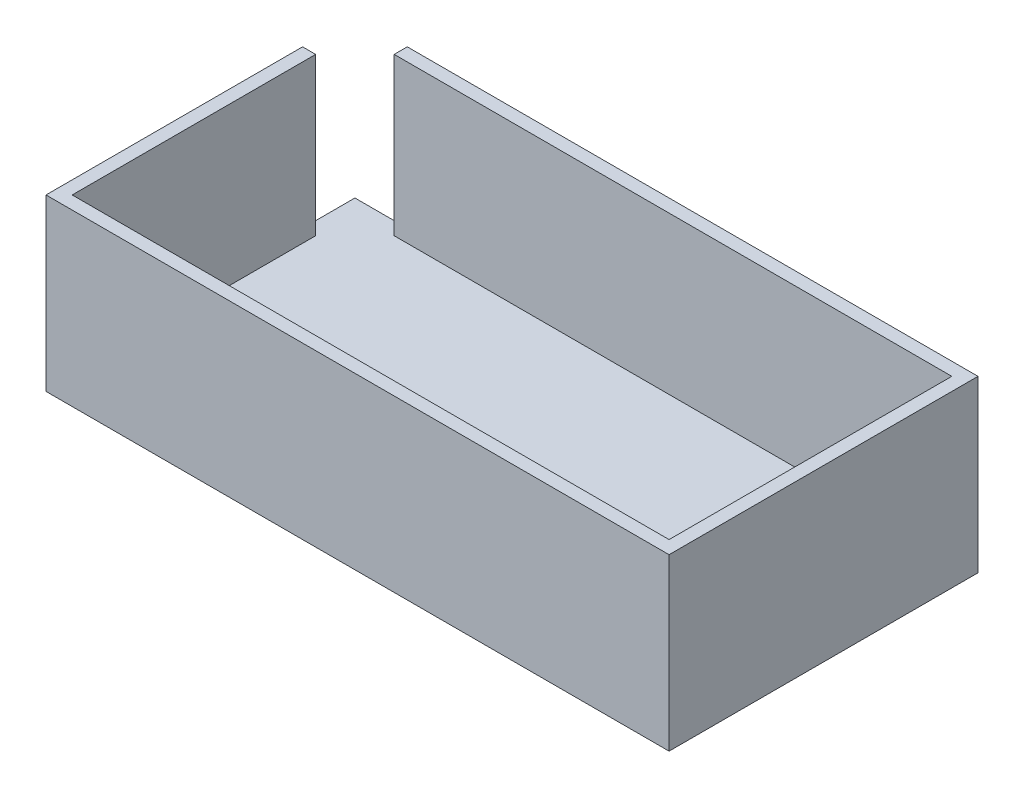
ISO-10303-21;
HEADER;
FILE_DESCRIPTION(('STEP AP214'),'2;1');
FILE_NAME('part.step','',(''),(''),'','','');
FILE_SCHEMA(('AUTOMOTIVE_DESIGN { 1 0 10303 214 1 1 1 1 }'));
ENDSEC;
DATA;
#1=APPLICATION_CONTEXT('core data for automotive mechanical design processes');
#2=APPLICATION_PROTOCOL_DEFINITION('international standard','automotive_design',2000,#1);
#3=PRODUCT_CONTEXT('',#1,'mechanical');
#4=PRODUCT('Part','Part','',(#3));
#5=PRODUCT_RELATED_PRODUCT_CATEGORY('part','',(#4));
#6=PRODUCT_DEFINITION_FORMATION('','',#4);
#7=PRODUCT_DEFINITION_CONTEXT('part definition',#1,'design');
#8=PRODUCT_DEFINITION('design','',#6,#7);
#9=PRODUCT_DEFINITION_SHAPE('','',#8);
#10=(LENGTH_UNIT() NAMED_UNIT(*) SI_UNIT(.MILLI.,.METRE.));
#11=(NAMED_UNIT(*) PLANE_ANGLE_UNIT() SI_UNIT($,.RADIAN.));
#12=(NAMED_UNIT(*) SI_UNIT($,.STERADIAN.) SOLID_ANGLE_UNIT());
#13=UNCERTAINTY_MEASURE_WITH_UNIT(LENGTH_MEASURE(1.E-05),#10,'distance_accuracy_value','');
#14=(GEOMETRIC_REPRESENTATION_CONTEXT(3) GLOBAL_UNCERTAINTY_ASSIGNED_CONTEXT((#13)) GLOBAL_UNIT_ASSIGNED_CONTEXT((#10,
#11,#12)) REPRESENTATION_CONTEXT('',''));
#15=CARTESIAN_POINT('',(0.,0.,0.));
#16=DIRECTION('',(0.,0.,1.));
#17=DIRECTION('',(1.,0.,0.));
#18=AXIS2_PLACEMENT_3D('',#15,#16,#17);
#19=CARTESIAN_POINT('',(0.,19.05,0.));
#20=DIRECTION('',(0.,-1.,0.));
#21=DIRECTION('',(0.,0.,-1.));
#22=AXIS2_PLACEMENT_3D('',#19,#20,#21);
#23=PLANE('',#22);
#24=DIRECTION('',(-1.,0.,0.));
#25=VECTOR('',#24,1.);
#26=CARTESIAN_POINT('',(-1.5875,19.05,-35.8775));
#27=LINE('',#26,#25);
#28=CARTESIAN_POINT('',(73.9775,19.05,-35.8775));
#29=VERTEX_POINT('',#28);
#30=CARTESIAN_POINT('',(4.7625,19.05,-35.8775));
#31=VERTEX_POINT('',#30);
#32=EDGE_CURVE('E195',#29,#31,#27,.T.);
#33=ORIENTED_EDGE('',*,*,#32,.T.);
#34=DIRECTION('',(0.,0.,-1.));
#35=VECTOR('',#34,1.);
#36=CARTESIAN_POINT('',(4.7625,19.05,-35.8775));
#37=LINE('',#36,#35);
#38=CARTESIAN_POINT('',(4.7625,19.05,-34.29));
#39=VERTEX_POINT('',#38);
#40=EDGE_CURVE('E139',#39,#31,#37,.T.);
#41=ORIENTED_EDGE('',*,*,#40,.F.);
#42=DIRECTION('',(-1.,0.,0.));
#43=VECTOR('',#42,1.);
#44=CARTESIAN_POINT('',(0.,19.05,-34.29));
#45=LINE('',#44,#43);
#46=CARTESIAN_POINT('',(72.39,19.05,-34.29));
#47=VERTEX_POINT('',#46);
#48=EDGE_CURVE('E174',#47,#39,#45,.T.);
#49=ORIENTED_EDGE('',*,*,#48,.F.);
#50=DIRECTION('',(0.,0.,-1.));
#51=VECTOR('',#50,1.);
#52=CARTESIAN_POINT('',(72.39,19.05,0.));
#53=LINE('',#52,#51);
#54=CARTESIAN_POINT('',(72.39,19.05,0.));
#55=VERTEX_POINT('',#54);
#56=EDGE_CURVE('E172',#55,#47,#53,.T.);
#57=ORIENTED_EDGE('',*,*,#56,.F.);
#58=DIRECTION('',(1.,0.,0.));
#59=VECTOR('',#58,1.);
#60=CARTESIAN_POINT('',(0.,19.05,0.));
#61=LINE('',#60,#59);
#62=CARTESIAN_POINT('',(0.,19.05,0.));
#63=VERTEX_POINT('',#62);
#64=EDGE_CURVE('E169',#63,#55,#61,.T.);
#65=ORIENTED_EDGE('',*,*,#64,.F.);
#66=DIRECTION('',(0.,0.,1.));
#67=VECTOR('',#66,1.);
#68=CARTESIAN_POINT('',(0.,19.05,0.));
#69=LINE('',#68,#67);
#70=CARTESIAN_POINT('',(0.,19.05,-29.5275));
#71=VERTEX_POINT('',#70);
#72=EDGE_CURVE('E167',#71,#63,#69,.T.);
#73=ORIENTED_EDGE('',*,*,#72,.F.);
#74=DIRECTION('',(1.,0.,0.));
#75=VECTOR('',#74,1.);
#76=CARTESIAN_POINT('',(-1.5875,19.05,-29.5275));
#77=LINE('',#76,#75);
#78=CARTESIAN_POINT('',(-1.5875,19.05,-29.5275));
#79=VERTEX_POINT('',#78);
#80=EDGE_CURVE('E220',#79,#71,#77,.T.);
#81=ORIENTED_EDGE('',*,*,#80,.F.);
#82=DIRECTION('',(0.,0.,1.));
#83=VECTOR('',#82,1.);
#84=CARTESIAN_POINT('',(-1.58750000000001,19.05,1.58750000000001));
#85=LINE('',#84,#83);
#86=CARTESIAN_POINT('',(-1.58750000000001,19.05,1.58750000000001));
#87=VERTEX_POINT('',#86);
#88=EDGE_CURVE('E143',#79,#87,#85,.T.);
#89=ORIENTED_EDGE('',*,*,#88,.T.);
#90=DIRECTION('',(1.,0.,0.));
#91=VECTOR('',#90,1.);
#92=CARTESIAN_POINT('',(73.9775,19.05,1.5875));
#93=LINE('',#92,#91);
#94=CARTESIAN_POINT('',(73.9775,19.05,1.5875));
#95=VERTEX_POINT('',#94);
#96=EDGE_CURVE('E192',#87,#95,#93,.T.);
#97=ORIENTED_EDGE('',*,*,#96,.T.);
#98=DIRECTION('',(0.,0.,-1.));
#99=VECTOR('',#98,1.);
#100=CARTESIAN_POINT('',(73.9775,19.05,-35.8775));
#101=LINE('',#100,#99);
#102=EDGE_CURVE('E60',#95,#29,#101,.T.);
#103=ORIENTED_EDGE('',*,*,#102,.T.);
#104=EDGE_LOOP('',(#33,#41,#49,#57,#65,#73,#81,#89,#97,#103));
#105=FACE_BOUND('',#104,.T.);
#106=ADVANCED_FACE('F37',(#105),#23,.F.);
#107=CARTESIAN_POINT('',(-1.58750000000001,19.05,1.58750000000001));
#108=DIRECTION('',(1.,0.,0.));
#109=DIRECTION('',(0.,0.,-1.));
#110=AXIS2_PLACEMENT_3D('',#107,#108,#109);
#111=PLANE('',#110);
#112=ORIENTED_EDGE('',*,*,#88,.F.);
#113=DIRECTION('',(0.,1.,0.));
#114=VECTOR('',#113,1.);
#115=CARTESIAN_POINT('',(-1.5875,0.,-29.5275));
#116=LINE('',#115,#114);
#117=CARTESIAN_POINT('',(-1.5875,0.,-29.5275));
#118=VERTEX_POINT('',#117);
#119=EDGE_CURVE('E124',#118,#79,#116,.T.);
#120=ORIENTED_EDGE('',*,*,#119,.F.);
#121=DIRECTION('',(0.,0.,1.));
#122=VECTOR('',#121,1.);
#123=CARTESIAN_POINT('',(-1.5875,0.,-35.8775));
#124=LINE('',#123,#122);
#125=CARTESIAN_POINT('',(-1.5875,0.,-35.8775));
#126=VERTEX_POINT('',#125);
#127=EDGE_CURVE('E131',#126,#118,#124,.T.);
#128=ORIENTED_EDGE('',*,*,#127,.F.);
#129=DIRECTION('',(0.,-1.,0.));
#130=VECTOR('',#129,1.);
#131=CARTESIAN_POINT('',(-1.5875,19.05,-35.8775));
#132=LINE('',#131,#130);
#133=CARTESIAN_POINT('',(-1.58750000000001,-1.5875,-35.8775));
#134=VERTEX_POINT('',#133);
#135=EDGE_CURVE('E197',#126,#134,#132,.T.);
#136=ORIENTED_EDGE('',*,*,#135,.T.);
#137=DIRECTION('',(0.,0.,-1.));
#138=VECTOR('',#137,1.);
#139=CARTESIAN_POINT('',(-1.58750000000001,-1.5875,1.58750000000001));
#140=LINE('',#139,#138);
#141=CARTESIAN_POINT('',(-1.58750000000001,-1.5875,1.58750000000001));
#142=VERTEX_POINT('',#141);
#143=EDGE_CURVE('E154',#142,#134,#140,.T.);
#144=ORIENTED_EDGE('',*,*,#143,.F.);
#145=DIRECTION('',(0.,-1.,0.));
#146=VECTOR('',#145,1.);
#147=CARTESIAN_POINT('',(-1.58750000000001,19.05,1.58750000000001));
#148=LINE('',#147,#146);
#149=EDGE_CURVE('E11',#87,#142,#148,.T.);
#150=ORIENTED_EDGE('',*,*,#149,.F.);
#151=EDGE_LOOP('',(#112,#120,#128,#136,#144,#150));
#152=FACE_BOUND('',#151,.T.);
#153=ADVANCED_FACE('F39',(#152),#111,.F.);
#154=CARTESIAN_POINT('',(73.9775,19.05,1.5875));
#155=DIRECTION('',(0.,0.,-1.));
#156=DIRECTION('',(-1.,0.,0.));
#157=AXIS2_PLACEMENT_3D('',#154,#155,#156);
#158=PLANE('',#157);
#159=ORIENTED_EDGE('',*,*,#149,.T.);
#160=DIRECTION('',(-1.,0.,0.));
#161=VECTOR('',#160,1.);
#162=CARTESIAN_POINT('',(-1.58750000000001,-1.5875,1.58750000000001));
#163=LINE('',#162,#161);
#164=CARTESIAN_POINT('',(73.9775,-1.5875,1.58750000000001));
#165=VERTEX_POINT('',#164);
#166=EDGE_CURVE('E163',#165,#142,#163,.T.);
#167=ORIENTED_EDGE('',*,*,#166,.F.);
#168=DIRECTION('',(0.,-1.,0.));
#169=VECTOR('',#168,1.);
#170=CARTESIAN_POINT('',(73.9775,19.05,1.5875));
#171=LINE('',#170,#169);
#172=EDGE_CURVE('E45',#95,#165,#171,.T.);
#173=ORIENTED_EDGE('',*,*,#172,.F.);
#174=ORIENTED_EDGE('',*,*,#96,.F.);
#175=EDGE_LOOP('',(#159,#167,#173,#174));
#176=FACE_BOUND('',#175,.T.);
#177=ADVANCED_FACE('F211',(#176),#158,.F.);
#178=CARTESIAN_POINT('',(73.9775,19.05,-35.8775));
#179=DIRECTION('',(-1.,0.,0.));
#180=DIRECTION('',(0.,0.,1.));
#181=AXIS2_PLACEMENT_3D('',#178,#179,#180);
#182=PLANE('',#181);
#183=ORIENTED_EDGE('',*,*,#172,.T.);
#184=DIRECTION('',(0.,0.,1.));
#185=VECTOR('',#184,1.);
#186=CARTESIAN_POINT('',(73.9775,-1.5875,1.58750000000001));
#187=LINE('',#186,#185);
#188=CARTESIAN_POINT('',(73.9775,-1.5875,-35.8775));
#189=VERTEX_POINT('',#188);
#190=EDGE_CURVE('E160',#189,#165,#187,.T.);
#191=ORIENTED_EDGE('',*,*,#190,.F.);
#192=DIRECTION('',(0.,-1.,0.));
#193=VECTOR('',#192,1.);
#194=CARTESIAN_POINT('',(73.9775,19.05,-35.8775));
#195=LINE('',#194,#193);
#196=EDGE_CURVE('E199',#29,#189,#195,.T.);
#197=ORIENTED_EDGE('',*,*,#196,.F.);
#198=ORIENTED_EDGE('',*,*,#102,.F.);
#199=EDGE_LOOP('',(#183,#191,#197,#198));
#200=FACE_BOUND('',#199,.T.);
#201=ADVANCED_FACE('F203',(#200),#182,.F.);
#202=CARTESIAN_POINT('',(-1.5875,19.05,-35.8775));
#203=DIRECTION('',(0.,0.,1.));
#204=DIRECTION('',(1.,0.,0.));
#205=AXIS2_PLACEMENT_3D('',#202,#203,#204);
#206=PLANE('',#205);
#207=DIRECTION('',(-1.,0.,0.));
#208=VECTOR('',#207,1.);
#209=CARTESIAN_POINT('',(-1.5875,0.,-35.8775));
#210=LINE('',#209,#208);
#211=CARTESIAN_POINT('',(4.7625,0.,-35.8775));
#212=VERTEX_POINT('',#211);
#213=EDGE_CURVE('E136',#212,#126,#210,.T.);
#214=ORIENTED_EDGE('',*,*,#213,.F.);
#215=DIRECTION('',(0.,1.,0.));
#216=VECTOR('',#215,1.);
#217=CARTESIAN_POINT('',(4.7625,0.,-35.8775));
#218=LINE('',#217,#216);
#219=EDGE_CURVE('E144',#212,#31,#218,.T.);
#220=ORIENTED_EDGE('',*,*,#219,.T.);
#221=ORIENTED_EDGE('',*,*,#32,.F.);
#222=ORIENTED_EDGE('',*,*,#196,.T.);
#223=DIRECTION('',(1.,0.,0.));
#224=VECTOR('',#223,1.);
#225=CARTESIAN_POINT('',(-1.58750000000001,-1.5875,-35.8775));
#226=LINE('',#225,#224);
#227=EDGE_CURVE('E157',#134,#189,#226,.T.);
#228=ORIENTED_EDGE('',*,*,#227,.F.);
#229=ORIENTED_EDGE('',*,*,#135,.F.);
#230=EDGE_LOOP('',(#214,#220,#221,#222,#228,#229));
#231=FACE_BOUND('',#230,.T.);
#232=ADVANCED_FACE('F213',(#231),#206,.F.);
#233=CARTESIAN_POINT('',(0.,19.05,0.));
#234=DIRECTION('',(1.,0.,0.));
#235=DIRECTION('',(0.,0.,-1.));
#236=AXIS2_PLACEMENT_3D('',#233,#234,#235);
#237=PLANE('',#236);
#238=DIRECTION('',(0.,-1.,0.));
#239=VECTOR('',#238,1.);
#240=CARTESIAN_POINT('',(0.,19.05,-29.5275));
#241=LINE('',#240,#239);
#242=CARTESIAN_POINT('',(0.,0.,-29.5275));
#243=VERTEX_POINT('',#242);
#244=EDGE_CURVE('E127',#71,#243,#241,.T.);
#245=ORIENTED_EDGE('',*,*,#244,.F.);
#246=ORIENTED_EDGE('',*,*,#72,.T.);
#247=DIRECTION('',(0.,-1.,0.));
#248=VECTOR('',#247,1.);
#249=CARTESIAN_POINT('',(0.,19.05,0.));
#250=LINE('',#249,#248);
#251=CARTESIAN_POINT('',(0.,0.,0.));
#252=VERTEX_POINT('',#251);
#253=EDGE_CURVE('E188',#63,#252,#250,.T.);
#254=ORIENTED_EDGE('',*,*,#253,.T.);
#255=DIRECTION('',(0.,0.,1.));
#256=VECTOR('',#255,1.);
#257=CARTESIAN_POINT('',(0.,0.,0.));
#258=LINE('',#257,#256);
#259=EDGE_CURVE('E166',#243,#252,#258,.T.);
#260=ORIENTED_EDGE('',*,*,#259,.F.);
#261=EDGE_LOOP('',(#245,#246,#254,#260));
#262=FACE_BOUND('',#261,.T.);
#263=ADVANCED_FACE('F234',(#262),#237,.T.);
#264=CARTESIAN_POINT('',(0.,19.05,0.));
#265=DIRECTION('',(0.,0.,-1.));
#266=DIRECTION('',(-1.,0.,0.));
#267=AXIS2_PLACEMENT_3D('',#264,#265,#266);
#268=PLANE('',#267);
#269=DIRECTION('',(1.,0.,0.));
#270=VECTOR('',#269,1.);
#271=CARTESIAN_POINT('',(0.,0.,0.));
#272=LINE('',#271,#270);
#273=CARTESIAN_POINT('',(72.39,0.,0.));
#274=VERTEX_POINT('',#273);
#275=EDGE_CURVE('E177',#252,#274,#272,.T.);
#276=ORIENTED_EDGE('',*,*,#275,.F.);
#277=ORIENTED_EDGE('',*,*,#253,.F.);
#278=ORIENTED_EDGE('',*,*,#64,.T.);
#279=DIRECTION('',(0.,-1.,0.));
#280=VECTOR('',#279,1.);
#281=CARTESIAN_POINT('',(72.39,19.05,0.));
#282=LINE('',#281,#280);
#283=EDGE_CURVE('E186',#55,#274,#282,.T.);
#284=ORIENTED_EDGE('',*,*,#283,.T.);
#285=EDGE_LOOP('',(#276,#277,#278,#284));
#286=FACE_BOUND('',#285,.T.);
#287=ADVANCED_FACE('F232',(#286),#268,.T.);
#288=CARTESIAN_POINT('',(72.39,19.05,0.));
#289=DIRECTION('',(-1.,0.,0.));
#290=DIRECTION('',(0.,0.,1.));
#291=AXIS2_PLACEMENT_3D('',#288,#289,#290);
#292=PLANE('',#291);
#293=DIRECTION('',(0.,0.,-1.));
#294=VECTOR('',#293,1.);
#295=CARTESIAN_POINT('',(72.39,0.,0.));
#296=LINE('',#295,#294);
#297=CARTESIAN_POINT('',(72.39,0.,-34.29));
#298=VERTEX_POINT('',#297);
#299=EDGE_CURVE('E180',#274,#298,#296,.T.);
#300=ORIENTED_EDGE('',*,*,#299,.F.);
#301=ORIENTED_EDGE('',*,*,#283,.F.);
#302=ORIENTED_EDGE('',*,*,#56,.T.);
#303=DIRECTION('',(0.,-1.,0.));
#304=VECTOR('',#303,1.);
#305=CARTESIAN_POINT('',(72.39,19.05,-34.29));
#306=LINE('',#305,#304);
#307=EDGE_CURVE('E52',#47,#298,#306,.T.);
#308=ORIENTED_EDGE('',*,*,#307,.T.);
#309=EDGE_LOOP('',(#300,#301,#302,#308));
#310=FACE_BOUND('',#309,.T.);
#311=ADVANCED_FACE('F227',(#310),#292,.T.);
#312=CARTESIAN_POINT('',(0.,19.05,-34.29));
#313=DIRECTION('',(0.,0.,1.));
#314=DIRECTION('',(1.,0.,0.));
#315=AXIS2_PLACEMENT_3D('',#312,#313,#314);
#316=PLANE('',#315);
#317=DIRECTION('',(0.,1.,0.));
#318=VECTOR('',#317,1.);
#319=CARTESIAN_POINT('',(4.7625,19.05,-34.29));
#320=LINE('',#319,#318);
#321=CARTESIAN_POINT('',(4.7625,0.,-34.29));
#322=VERTEX_POINT('',#321);
#323=EDGE_CURVE('E152',#322,#39,#320,.T.);
#324=ORIENTED_EDGE('',*,*,#323,.F.);
#325=DIRECTION('',(-1.,0.,0.));
#326=VECTOR('',#325,1.);
#327=CARTESIAN_POINT('',(0.,0.,-34.29));
#328=LINE('',#327,#326);
#329=EDGE_CURVE('E170',#298,#322,#328,.T.);
#330=ORIENTED_EDGE('',*,*,#329,.F.);
#331=ORIENTED_EDGE('',*,*,#307,.F.);
#332=ORIENTED_EDGE('',*,*,#48,.T.);
#333=EDGE_LOOP('',(#324,#330,#331,#332));
#334=FACE_BOUND('',#333,.T.);
#335=ADVANCED_FACE('F222',(#334),#316,.T.);
#336=CARTESIAN_POINT('',(0.,0.,0.));
#337=DIRECTION('',(0.,-1.,0.));
#338=DIRECTION('',(0.,0.,-1.));
#339=AXIS2_PLACEMENT_3D('',#336,#337,#338);
#340=PLANE('',#339);
#341=DIRECTION('',(1.,0.,0.));
#342=VECTOR('',#341,1.);
#343=CARTESIAN_POINT('',(-1.5875,0.,-29.5275));
#344=LINE('',#343,#342);
#345=EDGE_CURVE('E120',#118,#243,#344,.T.);
#346=ORIENTED_EDGE('',*,*,#345,.T.);
#347=ORIENTED_EDGE('',*,*,#259,.T.);
#348=ORIENTED_EDGE('',*,*,#275,.T.);
#349=ORIENTED_EDGE('',*,*,#299,.T.);
#350=ORIENTED_EDGE('',*,*,#329,.T.);
#351=DIRECTION('',(0.,0.,-1.));
#352=VECTOR('',#351,1.);
#353=CARTESIAN_POINT('',(4.7625,0.,-35.8775));
#354=LINE('',#353,#352);
#355=EDGE_CURVE('E130',#322,#212,#354,.T.);
#356=ORIENTED_EDGE('',*,*,#355,.T.);
#357=ORIENTED_EDGE('',*,*,#213,.T.);
#358=ORIENTED_EDGE('',*,*,#127,.T.);
#359=EDGE_LOOP('',(#346,#347,#348,#349,#350,#356,#357,#358));
#360=FACE_BOUND('',#359,.T.);
#361=ADVANCED_FACE('F134',(#360),#340,.F.);
#362=CARTESIAN_POINT('',(0.,-1.5875,0.));
#363=DIRECTION('',(0.,-1.,0.));
#364=DIRECTION('',(0.,0.,-1.));
#365=AXIS2_PLACEMENT_3D('',#362,#363,#364);
#366=PLANE('',#365);
#367=ORIENTED_EDGE('',*,*,#143,.T.);
#368=ORIENTED_EDGE('',*,*,#227,.T.);
#369=ORIENTED_EDGE('',*,*,#190,.T.);
#370=ORIENTED_EDGE('',*,*,#166,.T.);
#371=EDGE_LOOP('',(#367,#368,#369,#370));
#372=FACE_BOUND('',#371,.T.);
#373=ADVANCED_FACE('F208',(#372),#366,.T.);
#374=CARTESIAN_POINT('',(4.7625,0.,-35.8775));
#375=DIRECTION('',(1.,0.,0.));
#376=DIRECTION('',(0.,0.,-1.));
#377=AXIS2_PLACEMENT_3D('',#374,#375,#376);
#378=PLANE('',#377);
#379=ORIENTED_EDGE('',*,*,#323,.T.);
#380=ORIENTED_EDGE('',*,*,#40,.T.);
#381=ORIENTED_EDGE('',*,*,#219,.F.);
#382=ORIENTED_EDGE('',*,*,#355,.F.);
#383=EDGE_LOOP('',(#379,#380,#381,#382));
#384=FACE_BOUND('',#383,.T.);
#385=ADVANCED_FACE('F278',(#384),#378,.F.);
#386=CARTESIAN_POINT('',(-1.5875,0.,-29.5275));
#387=DIRECTION('',(0.,0.,1.));
#388=DIRECTION('',(1.,0.,0.));
#389=AXIS2_PLACEMENT_3D('',#386,#387,#388);
#390=PLANE('',#389);
#391=ORIENTED_EDGE('',*,*,#244,.T.);
#392=ORIENTED_EDGE('',*,*,#345,.F.);
#393=ORIENTED_EDGE('',*,*,#119,.T.);
#394=ORIENTED_EDGE('',*,*,#80,.T.);
#395=EDGE_LOOP('',(#391,#392,#393,#394));
#396=FACE_BOUND('',#395,.T.);
#397=ADVANCED_FACE('F122',(#396),#390,.F.);
#398=CLOSED_SHELL('',(#106,#153,#177,#201,#232,#263,#287,#311,#335,#361,#373,#385,#397));
#399=MANIFOLD_SOLID_BREP('B2',#398);
#400=ADVANCED_BREP_SHAPE_REPRESENTATION('',(#18,#399),#14);
#401=SHAPE_DEFINITION_REPRESENTATION(#9,#400);
ENDSEC;
END-ISO-10303-21;
